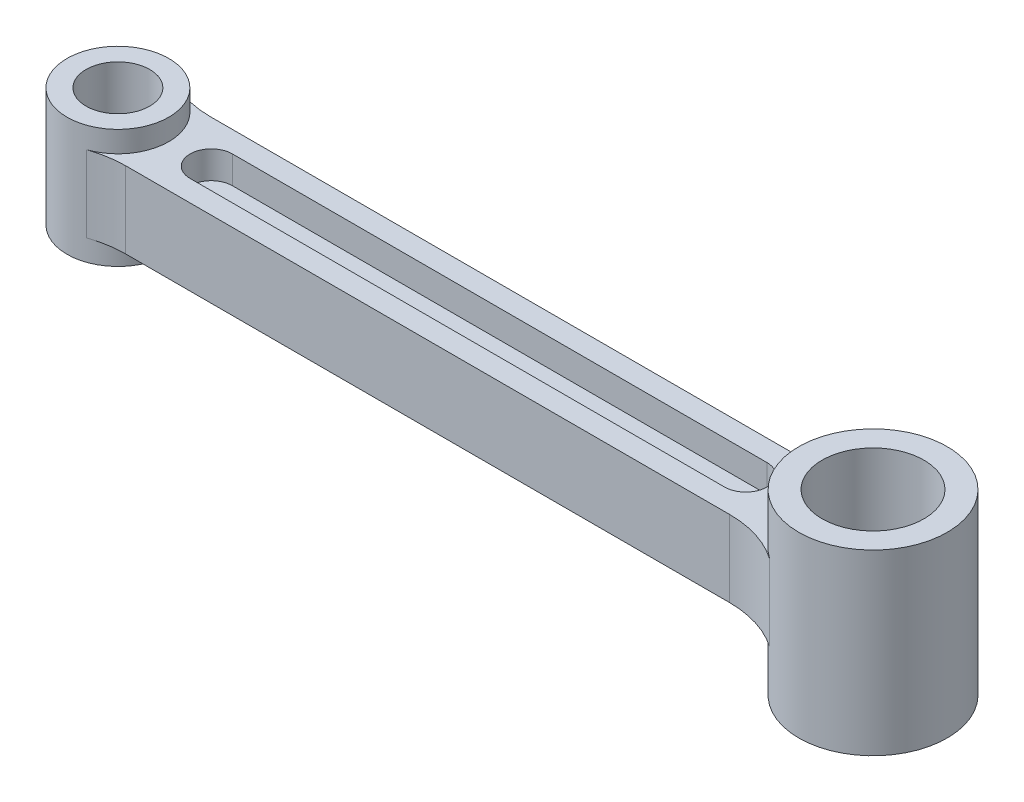
ISO-10303-21;
HEADER;
FILE_DESCRIPTION(('STEP AP214'),'2;1');
FILE_NAME('part.step','',(''),(''),'','','');
FILE_SCHEMA(('AUTOMOTIVE_DESIGN { 1 0 10303 214 1 1 1 1 }'));
ENDSEC;
DATA;
#1=APPLICATION_CONTEXT('core data for automotive mechanical design processes');
#2=APPLICATION_PROTOCOL_DEFINITION('international standard','automotive_design',2000,#1);
#3=PRODUCT_CONTEXT('',#1,'mechanical');
#4=PRODUCT('Part','Part','',(#3));
#5=PRODUCT_RELATED_PRODUCT_CATEGORY('part','',(#4));
#6=PRODUCT_DEFINITION_FORMATION('','',#4);
#7=PRODUCT_DEFINITION_CONTEXT('part definition',#1,'design');
#8=PRODUCT_DEFINITION('design','',#6,#7);
#9=PRODUCT_DEFINITION_SHAPE('','',#8);
#10=(LENGTH_UNIT() NAMED_UNIT(*) SI_UNIT(.MILLI.,.METRE.));
#11=(NAMED_UNIT(*) PLANE_ANGLE_UNIT() SI_UNIT($,.RADIAN.));
#12=(NAMED_UNIT(*) SI_UNIT($,.STERADIAN.) SOLID_ANGLE_UNIT());
#13=UNCERTAINTY_MEASURE_WITH_UNIT(LENGTH_MEASURE(1.E-05),#10,'distance_accuracy_value','');
#14=(GEOMETRIC_REPRESENTATION_CONTEXT(3) GLOBAL_UNCERTAINTY_ASSIGNED_CONTEXT((#13)) GLOBAL_UNIT_ASSIGNED_CONTEXT((#10,
#11,#12)) REPRESENTATION_CONTEXT('',''));
#15=CARTESIAN_POINT('',(0.,0.,0.));
#16=DIRECTION('',(0.,0.,1.));
#17=DIRECTION('',(1.,0.,0.));
#18=AXIS2_PLACEMENT_3D('',#15,#16,#17);
#19=CARTESIAN_POINT('',(-63.,-9.,0.));
#20=DIRECTION('',(0.,1.,0.));
#21=DIRECTION('',(0.,0.,1.));
#22=AXIS2_PLACEMENT_3D('',#19,#20,#21);
#23=CYLINDRICAL_SURFACE('',#22,5.);
#24=CARTESIAN_POINT('',(-63.,-2.5,0.));
#25=DIRECTION('',(0.,1.,0.));
#26=DIRECTION('',(0.,0.,1.));
#27=AXIS2_PLACEMENT_3D('',#24,#25,#26);
#28=CIRCLE('',#27,5.);
#29=CARTESIAN_POINT('',(-63.,-2.5,-5.));
#30=VERTEX_POINT('',#29);
#31=CARTESIAN_POINT('',(-63.,-2.5,5.));
#32=VERTEX_POINT('',#31);
#33=EDGE_CURVE('E193',#30,#32,#28,.T.);
#34=ORIENTED_EDGE('',*,*,#33,.T.);
#35=DIRECTION('',(0.,1.,0.));
#36=VECTOR('',#35,1.);
#37=CARTESIAN_POINT('',(-63.,-9.,5.));
#38=LINE('',#37,#36);
#39=CARTESIAN_POINT('',(-63.,-9.,5.));
#40=VERTEX_POINT('',#39);
#41=EDGE_CURVE('E336',#40,#32,#38,.T.);
#42=ORIENTED_EDGE('',*,*,#41,.F.);
#43=CARTESIAN_POINT('',(-63.,-9.,0.));
#44=DIRECTION('',(0.,1.,0.));
#45=DIRECTION('',(0.,0.,1.));
#46=AXIS2_PLACEMENT_3D('',#43,#44,#45);
#47=CIRCLE('',#46,5.);
#48=CARTESIAN_POINT('',(-63.,-9.,-5.));
#49=VERTEX_POINT('',#48);
#50=EDGE_CURVE('E265',#49,#40,#47,.T.);
#51=ORIENTED_EDGE('',*,*,#50,.F.);
#52=DIRECTION('',(0.,1.,0.));
#53=VECTOR('',#52,1.);
#54=CARTESIAN_POINT('',(-63.,-9.,-5.));
#55=LINE('',#54,#53);
#56=EDGE_CURVE('E172',#49,#30,#55,.T.);
#57=ORIENTED_EDGE('',*,*,#56,.T.);
#58=EDGE_LOOP('',(#34,#42,#51,#57));
#59=FACE_BOUND('',#58,.T.);
#60=ADVANCED_FACE('F47',(#59),#23,.F.);
#61=CARTESIAN_POINT('',(0.,-9.,5.));
#62=DIRECTION('',(0.,0.,1.));
#63=DIRECTION('',(1.,0.,0.));
#64=AXIS2_PLACEMENT_3D('',#61,#62,#63);
#65=PLANE('',#64);
#66=DIRECTION('',(1.,0.,0.));
#67=VECTOR('',#66,1.);
#68=CARTESIAN_POINT('',(0.,-2.5,5.));
#69=LINE('',#68,#67);
#70=CARTESIAN_POINT('',(63.,-2.5,5.));
#71=VERTEX_POINT('',#70);
#72=EDGE_CURVE('E197',#32,#71,#69,.T.);
#73=ORIENTED_EDGE('',*,*,#72,.T.);
#74=DIRECTION('',(0.,1.,0.));
#75=VECTOR('',#74,1.);
#76=CARTESIAN_POINT('',(63.,-9.,5.));
#77=LINE('',#76,#75);
#78=CARTESIAN_POINT('',(63.,-9.,5.));
#79=VERTEX_POINT('',#78);
#80=EDGE_CURVE('E340',#79,#71,#77,.T.);
#81=ORIENTED_EDGE('',*,*,#80,.F.);
#82=DIRECTION('',(1.,0.,0.));
#83=VECTOR('',#82,1.);
#84=CARTESIAN_POINT('',(0.,-9.,5.));
#85=LINE('',#84,#83);
#86=EDGE_CURVE('E276',#40,#79,#85,.T.);
#87=ORIENTED_EDGE('',*,*,#86,.F.);
#88=ORIENTED_EDGE('',*,*,#41,.T.);
#89=EDGE_LOOP('',(#73,#81,#87,#88));
#90=FACE_BOUND('',#89,.T.);
#91=ADVANCED_FACE('F428',(#90),#65,.F.);
#92=CARTESIAN_POINT('',(63.,-9.,0.));
#93=DIRECTION('',(0.,1.,0.));
#94=DIRECTION('',(0.,0.,1.));
#95=AXIS2_PLACEMENT_3D('',#92,#93,#94);
#96=CYLINDRICAL_SURFACE('',#95,5.);
#97=CARTESIAN_POINT('',(63.,-2.5,0.));
#98=DIRECTION('',(0.,1.,0.));
#99=DIRECTION('',(0.,0.,1.));
#100=AXIS2_PLACEMENT_3D('',#97,#98,#99);
#101=CIRCLE('',#100,5.);
#102=CARTESIAN_POINT('',(63.,-2.5,-5.));
#103=VERTEX_POINT('',#102);
#104=EDGE_CURVE('E201',#71,#103,#101,.T.);
#105=ORIENTED_EDGE('',*,*,#104,.T.);
#106=DIRECTION('',(0.,1.,0.));
#107=VECTOR('',#106,1.);
#108=CARTESIAN_POINT('',(63.,-9.,-5.));
#109=LINE('',#108,#107);
#110=CARTESIAN_POINT('',(63.,-9.,-5.));
#111=VERTEX_POINT('',#110);
#112=EDGE_CURVE('E345',#111,#103,#109,.T.);
#113=ORIENTED_EDGE('',*,*,#112,.F.);
#114=CARTESIAN_POINT('',(63.,-9.,0.));
#115=DIRECTION('',(0.,1.,0.));
#116=DIRECTION('',(0.,0.,1.));
#117=AXIS2_PLACEMENT_3D('',#114,#115,#116);
#118=CIRCLE('',#117,5.);
#119=EDGE_CURVE('E273',#79,#111,#118,.T.);
#120=ORIENTED_EDGE('',*,*,#119,.F.);
#121=ORIENTED_EDGE('',*,*,#80,.T.);
#122=EDGE_LOOP('',(#105,#113,#120,#121));
#123=FACE_BOUND('',#122,.T.);
#124=ADVANCED_FACE('F435',(#123),#96,.F.);
#125=CARTESIAN_POINT('',(0.,-9.,-5.));
#126=DIRECTION('',(0.,0.,1.));
#127=DIRECTION('',(1.,0.,0.));
#128=AXIS2_PLACEMENT_3D('',#125,#126,#127);
#129=PLANE('',#128);
#130=ORIENTED_EDGE('',*,*,#112,.T.);
#131=DIRECTION('',(1.,0.,0.));
#132=VECTOR('',#131,1.);
#133=CARTESIAN_POINT('',(0.,-2.5,-5.));
#134=LINE('',#133,#132);
#135=EDGE_CURVE('E190',#30,#103,#134,.T.);
#136=ORIENTED_EDGE('',*,*,#135,.F.);
#137=ORIENTED_EDGE('',*,*,#56,.F.);
#138=DIRECTION('',(1.,0.,0.));
#139=VECTOR('',#138,1.);
#140=CARTESIAN_POINT('',(0.,-9.,-5.));
#141=LINE('',#140,#139);
#142=EDGE_CURVE('E269',#49,#111,#141,.T.);
#143=ORIENTED_EDGE('',*,*,#142,.T.);
#144=EDGE_LOOP('',(#130,#136,#137,#143));
#145=FACE_BOUND('',#144,.T.);
#146=ADVANCED_FACE('F379',(#145),#129,.T.);
#147=CARTESIAN_POINT('',(93.,-21.,0.));
#148=DIRECTION('',(0.,1.,0.));
#149=DIRECTION('',(0.,0.,1.));
#150=AXIS2_PLACEMENT_3D('',#147,#148,#149);
#151=CYLINDRICAL_SURFACE('',#150,17.5);
#152=CARTESIAN_POINT('',(93.,-21.,0.));
#153=DIRECTION('',(0.,1.,0.));
#154=DIRECTION('',(0.,0.,1.));
#155=AXIS2_PLACEMENT_3D('',#152,#153,#154);
#156=CIRCLE('',#155,17.5);
#157=CARTESIAN_POINT('',(93.,-21.,17.5));
#158=VERTEX_POINT('',#157);
#159=EDGE_CURVE('E11',#158,#158,#156,.T.);
#160=ORIENTED_EDGE('',*,*,#159,.T.);
#161=EDGE_LOOP('',(#160));
#162=FACE_BOUND('',#161,.T.);
#163=CARTESIAN_POINT('',(93.,21.,0.));
#164=DIRECTION('',(0.,1.,0.));
#165=DIRECTION('',(0.,0.,1.));
#166=AXIS2_PLACEMENT_3D('',#163,#164,#165);
#167=CIRCLE('',#166,17.5);
#168=CARTESIAN_POINT('',(93.,21.,17.5));
#169=VERTEX_POINT('',#168);
#170=EDGE_CURVE('E355',#169,#169,#167,.T.);
#171=ORIENTED_EDGE('',*,*,#170,.F.);
#172=EDGE_LOOP('',(#171));
#173=FACE_BOUND('',#172,.T.);
#174=DIRECTION('',(0.,1.,0.));
#175=VECTOR('',#174,1.);
#176=CARTESIAN_POINT('',(82.9655387662608,-9.,14.3373493975904));
#177=LINE('',#176,#175);
#178=CARTESIAN_POINT('',(82.9655387662608,-9.,14.3373493975904));
#179=VERTEX_POINT('',#178);
#180=CARTESIAN_POINT('',(82.9655387662608,9.,14.3373493975904));
#181=VERTEX_POINT('',#180);
#182=EDGE_CURVE('E322',#179,#181,#177,.T.);
#183=ORIENTED_EDGE('',*,*,#182,.F.);
#184=CARTESIAN_POINT('',(93.,-9.,0.));
#185=DIRECTION('',(0.,1.,0.));
#186=DIRECTION('',(0.,0.,1.));
#187=AXIS2_PLACEMENT_3D('',#184,#185,#186);
#188=CIRCLE('',#187,17.5);
#189=CARTESIAN_POINT('',(82.9655387662608,-9.,-14.3373493975904));
#190=VERTEX_POINT('',#189);
#191=EDGE_CURVE('E295',#190,#179,#188,.T.);
#192=ORIENTED_EDGE('',*,*,#191,.F.);
#193=DIRECTION('',(0.,1.,0.));
#194=VECTOR('',#193,1.);
#195=CARTESIAN_POINT('',(82.9655387662608,-9.,-14.3373493975904));
#196=LINE('',#195,#194);
#197=CARTESIAN_POINT('',(82.9655387662608,9.,-14.3373493975904));
#198=VERTEX_POINT('',#197);
#199=EDGE_CURVE('E319',#190,#198,#196,.T.);
#200=ORIENTED_EDGE('',*,*,#199,.T.);
#201=CARTESIAN_POINT('',(93.,9.,0.));
#202=DIRECTION('',(0.,1.,0.));
#203=DIRECTION('',(0.,0.,1.));
#204=AXIS2_PLACEMENT_3D('',#201,#202,#203);
#205=CIRCLE('',#204,17.5);
#206=EDGE_CURVE('E250',#198,#181,#205,.T.);
#207=ORIENTED_EDGE('',*,*,#206,.T.);
#208=EDGE_LOOP('',(#183,#192,#200,#207));
#209=FACE_BOUND('',#208,.T.);
#210=ADVANCED_FACE('F367',(#162,#173,#209),#151,.T.);
#211=CARTESIAN_POINT('',(93.,-21.,0.));
#212=DIRECTION('',(0.,1.,0.));
#213=DIRECTION('',(0.,0.,1.));
#214=AXIS2_PLACEMENT_3D('',#211,#212,#213);
#215=CYLINDRICAL_SURFACE('',#214,12.);
#216=CARTESIAN_POINT('',(93.,-21.,0.));
#217=DIRECTION('',(0.,1.,0.));
#218=DIRECTION('',(0.,0.,1.));
#219=AXIS2_PLACEMENT_3D('',#216,#217,#218);
#220=CIRCLE('',#219,12.);
#221=CARTESIAN_POINT('',(93.,-21.,12.));
#222=VERTEX_POINT('',#221);
#223=EDGE_CURVE('E56',#222,#222,#220,.T.);
#224=CARTESIAN_POINT('',(93.,21.,0.));
#225=DIRECTION('',(0.,1.,0.));
#226=DIRECTION('',(0.,0.,1.));
#227=AXIS2_PLACEMENT_3D('',#224,#225,#226);
#228=CIRCLE('',#227,12.);
#229=CARTESIAN_POINT('',(93.,21.,12.));
#230=VERTEX_POINT('',#229);
#231=EDGE_CURVE('E312',#230,#230,#228,.T.);
#232=CARTESIAN_POINT('',(93.,-21.,12.));
#233=CARTESIAN_POINT('',(93.,-20.5625,12.));
#234=CARTESIAN_POINT('',(93.,-20.125,12.));
#235=CARTESIAN_POINT('',(93.,-19.25,12.));
#236=CARTESIAN_POINT('',(93.,-18.8125,12.));
#237=CARTESIAN_POINT('',(93.,-17.9375,12.));
#238=CARTESIAN_POINT('',(93.,-17.5,12.));
#239=CARTESIAN_POINT('',(93.,-16.625,12.));
#240=CARTESIAN_POINT('',(93.,-16.1875,12.));
#241=CARTESIAN_POINT('',(93.,-15.3125,12.));
#242=CARTESIAN_POINT('',(93.,-14.875,12.));
#243=CARTESIAN_POINT('',(93.,-14.,12.));
#244=CARTESIAN_POINT('',(93.,-13.5625,12.));
#245=CARTESIAN_POINT('',(93.,-12.6875,12.));
#246=CARTESIAN_POINT('',(93.,-12.25,12.));
#247=CARTESIAN_POINT('',(93.,-11.375,12.));
#248=CARTESIAN_POINT('',(93.,-10.9375,12.));
#249=CARTESIAN_POINT('',(93.,-10.0625,12.));
#250=CARTESIAN_POINT('',(93.,-9.625,12.));
#251=CARTESIAN_POINT('',(93.,-8.75,12.));
#252=CARTESIAN_POINT('',(93.,-8.3125,12.));
#253=CARTESIAN_POINT('',(93.,-7.4375,12.));
#254=CARTESIAN_POINT('',(93.,-7.,12.));
#255=CARTESIAN_POINT('',(93.,-6.125,12.));
#256=CARTESIAN_POINT('',(93.,-5.6875,12.));
#257=CARTESIAN_POINT('',(93.,-4.8125,12.));
#258=CARTESIAN_POINT('',(93.,-4.375,12.));
#259=CARTESIAN_POINT('',(93.,-3.5,12.));
#260=CARTESIAN_POINT('',(93.,-3.0625,12.));
#261=CARTESIAN_POINT('',(93.,-2.18750000000001,12.));
#262=CARTESIAN_POINT('',(93.,-1.75000000000001,12.));
#263=CARTESIAN_POINT('',(93.,-0.875000000000004,12.));
#264=CARTESIAN_POINT('',(93.,-0.437500000000004,12.));
#265=CARTESIAN_POINT('',(93.,0.437499999999997,12.));
#266=CARTESIAN_POINT('',(93.,0.874999999999997,12.));
#267=CARTESIAN_POINT('',(93.,1.75,12.));
#268=CARTESIAN_POINT('',(93.,2.1875,12.));
#269=CARTESIAN_POINT('',(93.,3.0625,12.));
#270=CARTESIAN_POINT('',(93.,3.5,12.));
#271=CARTESIAN_POINT('',(93.,4.375,12.));
#272=CARTESIAN_POINT('',(93.,4.8125,12.));
#273=CARTESIAN_POINT('',(93.,5.6875,12.));
#274=CARTESIAN_POINT('',(93.,6.125,12.));
#275=CARTESIAN_POINT('',(93.,7.,12.));
#276=CARTESIAN_POINT('',(93.,7.4375,12.));
#277=CARTESIAN_POINT('',(93.,8.3125,12.));
#278=CARTESIAN_POINT('',(93.,8.75,12.));
#279=CARTESIAN_POINT('',(93.,9.625,12.));
#280=CARTESIAN_POINT('',(93.,10.0625,12.));
#281=CARTESIAN_POINT('',(93.,10.9375,12.));
#282=CARTESIAN_POINT('',(93.,11.375,12.));
#283=CARTESIAN_POINT('',(93.,12.25,12.));
#284=CARTESIAN_POINT('',(93.,12.6875,12.));
#285=CARTESIAN_POINT('',(93.,13.5625,12.));
#286=CARTESIAN_POINT('',(93.,14.,12.));
#287=CARTESIAN_POINT('',(93.,14.875,12.));
#288=CARTESIAN_POINT('',(93.,15.3125,12.));
#289=CARTESIAN_POINT('',(93.,16.1875,12.));
#290=CARTESIAN_POINT('',(93.,16.625,12.));
#291=CARTESIAN_POINT('',(93.,17.5,12.));
#292=CARTESIAN_POINT('',(93.,17.9375,12.));
#293=CARTESIAN_POINT('',(93.,18.8125,12.));
#294=CARTESIAN_POINT('',(93.,19.25,12.));
#295=CARTESIAN_POINT('',(93.,20.125,12.));
#296=CARTESIAN_POINT('',(93.,20.5625,12.));
#297=CARTESIAN_POINT('',(93.,21.,12.));
#298=B_SPLINE_CURVE_WITH_KNOTS('',3,(#232,#233,#234,#235,#236,#237,#238,#239,#240,#241,#242,
#243,#244,#245,#246,#247,#248,#249,#250,#251,#252,#253,#254,#255,#256,#257,#258,#259,#260,#261,
#262,#263,#264,#265,#266,#267,#268,#269,#270,#271,#272,#273,#274,#275,#276,#277,#278,#279,#280,
#281,#282,#283,#284,#285,#286,#287,#288,#289,#290,#291,#292,#293,#294,#295,#296,#297),
.UNSPECIFIED.,.F.,.F.,(4,2,2,2,2,2,2,2,2,2,2,2,2,2,2,2,2,2,2,2,2,2,2,2,2,2,2,2,2,2,2,2,4),(0.,
1.3125,2.625,3.9375,5.25,6.5625,7.875,9.1875,10.5,11.8125,13.125,14.4375,15.75,17.0625,18.375,
19.6875,21.,22.3125,23.625,24.9375,26.25,27.5625,28.875,30.1875,31.5,32.8125,34.125,35.4375,
36.75,38.0625,39.375,40.6875,42.),.UNSPECIFIED.);
#299=EDGE_CURVE('BSEAM49',#222,#230,#298,.T.);
#300=ORIENTED_EDGE('',*,*,#223,.F.);
#301=ORIENTED_EDGE('',*,*,#231,.T.);
#302=ORIENTED_EDGE('',*,*,#299,.T.);
#303=ORIENTED_EDGE('',*,*,#299,.F.);
#304=EDGE_LOOP('',(#300,#302,#301,#303));
#305=FACE_BOUND('',#304,.T.);
#306=ADVANCED_FACE('F49',(#305),#215,.F.);
#307=CARTESIAN_POINT('',(0.,-21.,0.));
#308=DIRECTION('',(0.,1.,0.));
#309=DIRECTION('',(0.,0.,1.));
#310=AXIS2_PLACEMENT_3D('',#307,#308,#309);
#311=PLANE('',#310);
#312=ORIENTED_EDGE('',*,*,#223,.T.);
#313=EDGE_LOOP('',(#312));
#314=FACE_BOUND('',#313,.T.);
#315=ORIENTED_EDGE('',*,*,#159,.F.);
#316=EDGE_LOOP('',(#315));
#317=FACE_BOUND('',#316,.T.);
#318=ADVANCED_FACE('F362',(#314,#317),#311,.F.);
#319=CARTESIAN_POINT('',(0.,21.,0.));
#320=DIRECTION('',(0.,1.,0.));
#321=DIRECTION('',(0.,0.,1.));
#322=AXIS2_PLACEMENT_3D('',#319,#320,#321);
#323=PLANE('',#322);
#324=ORIENTED_EDGE('',*,*,#231,.F.);
#325=EDGE_LOOP('',(#324));
#326=FACE_BOUND('',#325,.T.);
#327=ORIENTED_EDGE('',*,*,#170,.T.);
#328=EDGE_LOOP('',(#327));
#329=FACE_BOUND('',#328,.T.);
#330=ADVANCED_FACE('F370',(#326,#329),#323,.T.);
#331=CARTESIAN_POINT('',(-73.1678404338008,-9.,-34.));
#332=DIRECTION('',(0.,1.,0.));
#333=DIRECTION('',(0.,0.,1.));
#334=AXIS2_PLACEMENT_3D('',#331,#332,#333);
#335=CYLINDRICAL_SURFACE('',#334,24.);
#336=DIRECTION('',(0.,1.,0.));
#337=VECTOR('',#336,1.);
#338=CARTESIAN_POINT('',(-81.0559468112669,-9.,-11.3333333333333));
#339=LINE('',#338,#337);
#340=CARTESIAN_POINT('',(-81.0559468112669,-9.,-11.3333333333333));
#341=VERTEX_POINT('',#340);
#342=CARTESIAN_POINT('',(-81.0559468112669,9.,-11.3333333333333));
#343=VERTEX_POINT('',#342);
#344=EDGE_CURVE('E308',#341,#343,#339,.T.);
#345=ORIENTED_EDGE('',*,*,#344,.T.);
#346=CARTESIAN_POINT('',(-73.1678404338008,9.,-34.));
#347=DIRECTION('',(0.,1.,0.));
#348=DIRECTION('',(0.,0.,1.));
#349=AXIS2_PLACEMENT_3D('',#346,#347,#348);
#350=CIRCLE('',#349,24.);
#351=CARTESIAN_POINT('',(-73.1678404338008,9.,-10.));
#352=VERTEX_POINT('',#351);
#353=EDGE_CURVE('E261',#343,#352,#350,.T.);
#354=ORIENTED_EDGE('',*,*,#353,.T.);
#355=DIRECTION('',(0.,1.,0.));
#356=VECTOR('',#355,1.);
#357=CARTESIAN_POINT('',(-73.1678404338008,-9.,-10.));
#358=LINE('',#357,#356);
#359=CARTESIAN_POINT('',(-73.1678404338008,-9.,-10.));
#360=VERTEX_POINT('',#359);
#361=EDGE_CURVE('E313',#360,#352,#358,.T.);
#362=ORIENTED_EDGE('',*,*,#361,.F.);
#363=CARTESIAN_POINT('',(-73.1678404338008,-9.,-34.));
#364=DIRECTION('',(0.,1.,0.));
#365=DIRECTION('',(0.,0.,1.));
#366=AXIS2_PLACEMENT_3D('',#363,#364,#365);
#367=CIRCLE('',#366,24.);
#368=EDGE_CURVE('E173',#341,#360,#367,.T.);
#369=ORIENTED_EDGE('',*,*,#368,.F.);
#370=EDGE_LOOP('',(#345,#354,#362,#369));
#371=FACE_BOUND('',#370,.T.);
#372=ADVANCED_FACE('F373',(#371),#335,.F.);
#373=CARTESIAN_POINT('',(0.,-9.,-10.));
#374=DIRECTION('',(0.,0.,1.));
#375=DIRECTION('',(1.,0.,0.));
#376=AXIS2_PLACEMENT_3D('',#373,#374,#375);
#377=PLANE('',#376);
#378=ORIENTED_EDGE('',*,*,#361,.T.);
#379=DIRECTION('',(1.,0.,0.));
#380=VECTOR('',#379,1.);
#381=CARTESIAN_POINT('',(0.,9.,-10.));
#382=LINE('',#381,#380);
#383=CARTESIAN_POINT('',(69.2039919314184,9.,-10.));
#384=VERTEX_POINT('',#383);
#385=EDGE_CURVE('E257',#352,#384,#382,.T.);
#386=ORIENTED_EDGE('',*,*,#385,.T.);
#387=DIRECTION('',(0.,1.,0.));
#388=VECTOR('',#387,1.);
#389=CARTESIAN_POINT('',(69.2039919314184,-9.,-10.));
#390=LINE('',#389,#388);
#391=CARTESIAN_POINT('',(69.2039919314184,-9.,-10.));
#392=VERTEX_POINT('',#391);
#393=EDGE_CURVE('E316',#392,#384,#390,.T.);
#394=ORIENTED_EDGE('',*,*,#393,.F.);
#395=DIRECTION('',(1.,0.,0.));
#396=VECTOR('',#395,1.);
#397=CARTESIAN_POINT('',(0.,-9.,-10.));
#398=LINE('',#397,#396);
#399=EDGE_CURVE('E303',#360,#392,#398,.T.);
#400=ORIENTED_EDGE('',*,*,#399,.F.);
#401=EDGE_LOOP('',(#378,#386,#394,#400));
#402=FACE_BOUND('',#401,.T.);
#403=ADVANCED_FACE('F408',(#402),#377,.F.);
#404=CARTESIAN_POINT('',(69.2039919314184,-9.,-34.));
#405=DIRECTION('',(0.,1.,0.));
#406=DIRECTION('',(0.,0.,1.));
#407=AXIS2_PLACEMENT_3D('',#404,#405,#406);
#408=CYLINDRICAL_SURFACE('',#407,24.);
#409=ORIENTED_EDGE('',*,*,#393,.T.);
#410=CARTESIAN_POINT('',(69.2039919314184,9.,-34.));
#411=DIRECTION('',(0.,1.,0.));
#412=DIRECTION('',(0.,0.,1.));
#413=AXIS2_PLACEMENT_3D('',#410,#411,#412);
#414=CIRCLE('',#413,24.);
#415=EDGE_CURVE('E253',#384,#198,#414,.T.);
#416=ORIENTED_EDGE('',*,*,#415,.T.);
#417=ORIENTED_EDGE('',*,*,#199,.F.);
#418=CARTESIAN_POINT('',(69.2039919314184,-9.,-34.));
#419=DIRECTION('',(0.,1.,0.));
#420=DIRECTION('',(0.,0.,1.));
#421=AXIS2_PLACEMENT_3D('',#418,#419,#420);
#422=CIRCLE('',#421,24.);
#423=EDGE_CURVE('E299',#392,#190,#422,.T.);
#424=ORIENTED_EDGE('',*,*,#423,.F.);
#425=EDGE_LOOP('',(#409,#416,#417,#424));
#426=FACE_BOUND('',#425,.T.);
#427=ADVANCED_FACE('F411',(#426),#408,.F.);
#428=CARTESIAN_POINT('',(69.2039919314184,-9.,34.));
#429=DIRECTION('',(0.,1.,0.));
#430=DIRECTION('',(0.,0.,1.));
#431=AXIS2_PLACEMENT_3D('',#428,#429,#430);
#432=CYLINDRICAL_SURFACE('',#431,24.);
#433=ORIENTED_EDGE('',*,*,#182,.T.);
#434=CARTESIAN_POINT('',(69.2039919314184,9.,34.));
#435=DIRECTION('',(0.,1.,0.));
#436=DIRECTION('',(0.,0.,1.));
#437=AXIS2_PLACEMENT_3D('',#434,#435,#436);
#438=CIRCLE('',#437,24.);
#439=CARTESIAN_POINT('',(69.2039919314184,9.,10.));
#440=VERTEX_POINT('',#439);
#441=EDGE_CURVE('E246',#440,#181,#438,.F.);
#442=ORIENTED_EDGE('',*,*,#441,.F.);
#443=DIRECTION('',(0.,1.,0.));
#444=VECTOR('',#443,1.);
#445=CARTESIAN_POINT('',(69.2039919314184,-9.,10.));
#446=LINE('',#445,#444);
#447=CARTESIAN_POINT('',(69.2039919314184,-9.,10.));
#448=VERTEX_POINT('',#447);
#449=EDGE_CURVE('E326',#448,#440,#446,.T.);
#450=ORIENTED_EDGE('',*,*,#449,.F.);
#451=CARTESIAN_POINT('',(69.2039919314184,-9.,34.));
#452=DIRECTION('',(0.,1.,0.));
#453=DIRECTION('',(0.,0.,1.));
#454=AXIS2_PLACEMENT_3D('',#451,#452,#453);
#455=CIRCLE('',#454,24.);
#456=EDGE_CURVE('E291',#448,#179,#455,.F.);
#457=ORIENTED_EDGE('',*,*,#456,.T.);
#458=EDGE_LOOP('',(#433,#442,#450,#457));
#459=FACE_BOUND('',#458,.T.);
#460=ADVANCED_FACE('F390',(#459),#432,.F.);
#461=CARTESIAN_POINT('',(0.,-9.,10.));
#462=DIRECTION('',(0.,0.,1.));
#463=DIRECTION('',(1.,0.,0.));
#464=AXIS2_PLACEMENT_3D('',#461,#462,#463);
#465=PLANE('',#464);
#466=ORIENTED_EDGE('',*,*,#449,.T.);
#467=DIRECTION('',(1.,0.,0.));
#468=VECTOR('',#467,1.);
#469=CARTESIAN_POINT('',(0.,9.,10.));
#470=LINE('',#469,#468);
#471=CARTESIAN_POINT('',(-73.1678404338008,9.,10.));
#472=VERTEX_POINT('',#471);
#473=EDGE_CURVE('E242',#472,#440,#470,.T.);
#474=ORIENTED_EDGE('',*,*,#473,.F.);
#475=DIRECTION('',(0.,1.,0.));
#476=VECTOR('',#475,1.);
#477=CARTESIAN_POINT('',(-73.1678404338008,-9.,10.));
#478=LINE('',#477,#476);
#479=CARTESIAN_POINT('',(-73.1678404338008,-9.,10.));
#480=VERTEX_POINT('',#479);
#481=EDGE_CURVE('E329',#480,#472,#478,.T.);
#482=ORIENTED_EDGE('',*,*,#481,.F.);
#483=DIRECTION('',(1.,0.,0.));
#484=VECTOR('',#483,1.);
#485=CARTESIAN_POINT('',(0.,-9.,10.));
#486=LINE('',#485,#484);
#487=EDGE_CURVE('E287',#480,#448,#486,.T.);
#488=ORIENTED_EDGE('',*,*,#487,.T.);
#489=EDGE_LOOP('',(#466,#474,#482,#488));
#490=FACE_BOUND('',#489,.T.);
#491=ADVANCED_FACE('F393',(#490),#465,.T.);
#492=CARTESIAN_POINT('',(-63.,2.5,5.));
#493=VERTEX_POINT('',#492);
#494=CARTESIAN_POINT('',(-63.,9.,5.));
#495=VERTEX_POINT('',#494);
#496=EDGE_CURVE('E178',#493,#495,#38,.T.);
#497=ORIENTED_EDGE('',*,*,#496,.F.);
#498=CARTESIAN_POINT('',(-63.,2.5,0.));
#499=DIRECTION('',(0.,1.,0.));
#500=DIRECTION('',(0.,0.,1.));
#501=AXIS2_PLACEMENT_3D('',#498,#499,#500);
#502=CIRCLE('',#501,5.);
#503=CARTESIAN_POINT('',(-63.,2.5,-5.));
#504=VERTEX_POINT('',#503);
#505=EDGE_CURVE('E176',#504,#493,#502,.T.);
#506=ORIENTED_EDGE('',*,*,#505,.F.);
#507=CARTESIAN_POINT('',(-63.,9.,-5.));
#508=VERTEX_POINT('',#507);
#509=EDGE_CURVE('E161',#504,#508,#55,.T.);
#510=ORIENTED_EDGE('',*,*,#509,.T.);
#511=CARTESIAN_POINT('',(-63.,9.,0.));
#512=DIRECTION('',(0.,1.,0.));
#513=DIRECTION('',(0.,0.,1.));
#514=AXIS2_PLACEMENT_3D('',#511,#512,#513);
#515=CIRCLE('',#514,5.);
#516=EDGE_CURVE('E221',#508,#495,#515,.T.);
#517=ORIENTED_EDGE('',*,*,#516,.T.);
#518=EDGE_LOOP('',(#497,#506,#510,#517));
#519=FACE_BOUND('',#518,.T.);
#520=ADVANCED_FACE('F177',(#519),#23,.F.);
#521=CARTESIAN_POINT('',(63.,2.5,5.));
#522=VERTEX_POINT('',#521);
#523=CARTESIAN_POINT('',(63.,9.,5.));
#524=VERTEX_POINT('',#523);
#525=EDGE_CURVE('E344',#522,#524,#77,.T.);
#526=ORIENTED_EDGE('',*,*,#525,.F.);
#527=DIRECTION('',(1.,0.,0.));
#528=VECTOR('',#527,1.);
#529=CARTESIAN_POINT('',(0.,2.5,5.));
#530=LINE('',#529,#528);
#531=EDGE_CURVE('E63',#493,#522,#530,.T.);
#532=ORIENTED_EDGE('',*,*,#531,.F.);
#533=ORIENTED_EDGE('',*,*,#496,.T.);
#534=DIRECTION('',(1.,0.,0.));
#535=VECTOR('',#534,1.);
#536=CARTESIAN_POINT('',(0.,9.,5.));
#537=LINE('',#536,#535);
#538=EDGE_CURVE('E230',#495,#524,#537,.T.);
#539=ORIENTED_EDGE('',*,*,#538,.T.);
#540=EDGE_LOOP('',(#526,#532,#533,#539));
#541=FACE_BOUND('',#540,.T.);
#542=ADVANCED_FACE('F438',(#541),#65,.F.);
#543=CARTESIAN_POINT('',(63.,2.5,-5.));
#544=VERTEX_POINT('',#543);
#545=CARTESIAN_POINT('',(63.,9.,-5.));
#546=VERTEX_POINT('',#545);
#547=EDGE_CURVE('E348',#544,#546,#109,.T.);
#548=ORIENTED_EDGE('',*,*,#547,.F.);
#549=CARTESIAN_POINT('',(63.,2.5,0.));
#550=DIRECTION('',(0.,1.,0.));
#551=DIRECTION('',(0.,0.,1.));
#552=AXIS2_PLACEMENT_3D('',#549,#550,#551);
#553=CIRCLE('',#552,5.);
#554=EDGE_CURVE('E71',#522,#544,#553,.T.);
#555=ORIENTED_EDGE('',*,*,#554,.F.);
#556=ORIENTED_EDGE('',*,*,#525,.T.);
#557=CARTESIAN_POINT('',(63.,9.,0.));
#558=DIRECTION('',(0.,1.,0.));
#559=DIRECTION('',(0.,0.,1.));
#560=AXIS2_PLACEMENT_3D('',#557,#558,#559);
#561=CIRCLE('',#560,5.);
#562=EDGE_CURVE('E226',#524,#546,#561,.T.);
#563=ORIENTED_EDGE('',*,*,#562,.T.);
#564=EDGE_LOOP('',(#548,#555,#556,#563));
#565=FACE_BOUND('',#564,.T.);
#566=ADVANCED_FACE('F445',(#565),#96,.F.);
#567=DIRECTION('',(1.,0.,0.));
#568=VECTOR('',#567,1.);
#569=CARTESIAN_POINT('',(0.,2.5,-5.));
#570=LINE('',#569,#568);
#571=EDGE_CURVE('E165',#504,#544,#570,.T.);
#572=ORIENTED_EDGE('',*,*,#571,.T.);
#573=ORIENTED_EDGE('',*,*,#547,.T.);
#574=DIRECTION('',(1.,0.,0.));
#575=VECTOR('',#574,1.);
#576=CARTESIAN_POINT('',(0.,9.,-5.));
#577=LINE('',#576,#575);
#578=EDGE_CURVE('E167',#508,#546,#577,.T.);
#579=ORIENTED_EDGE('',*,*,#578,.F.);
#580=ORIENTED_EDGE('',*,*,#509,.F.);
#581=EDGE_LOOP('',(#572,#573,#579,#580));
#582=FACE_BOUND('',#581,.T.);
#583=ADVANCED_FACE('F163',(#582),#129,.T.);
#584=CARTESIAN_POINT('',(-73.1678404338008,-9.,34.));
#585=DIRECTION('',(0.,1.,0.));
#586=DIRECTION('',(0.,0.,1.));
#587=AXIS2_PLACEMENT_3D('',#584,#585,#586);
#588=CYLINDRICAL_SURFACE('',#587,24.);
#589=ORIENTED_EDGE('',*,*,#481,.T.);
#590=CARTESIAN_POINT('',(-73.1678404338008,9.,34.));
#591=DIRECTION('',(0.,1.,0.));
#592=DIRECTION('',(0.,0.,1.));
#593=AXIS2_PLACEMENT_3D('',#590,#591,#592);
#594=CIRCLE('',#593,24.);
#595=CARTESIAN_POINT('',(-81.0559468112669,9.,11.3333333333333));
#596=VERTEX_POINT('',#595);
#597=EDGE_CURVE('E238',#596,#472,#594,.F.);
#598=ORIENTED_EDGE('',*,*,#597,.F.);
#599=DIRECTION('',(0.,1.,0.));
#600=VECTOR('',#599,1.);
#601=CARTESIAN_POINT('',(-81.0559468112669,-9.,11.3333333333333));
#602=LINE('',#601,#600);
#603=CARTESIAN_POINT('',(-81.0559468112669,-9.,11.3333333333333));
#604=VERTEX_POINT('',#603);
#605=EDGE_CURVE('E332',#604,#596,#602,.T.);
#606=ORIENTED_EDGE('',*,*,#605,.F.);
#607=CARTESIAN_POINT('',(-73.1678404338008,-9.,34.));
#608=DIRECTION('',(0.,1.,0.));
#609=DIRECTION('',(0.,0.,1.));
#610=AXIS2_PLACEMENT_3D('',#607,#608,#609);
#611=CIRCLE('',#610,24.);
#612=EDGE_CURVE('E283',#604,#480,#611,.F.);
#613=ORIENTED_EDGE('',*,*,#612,.T.);
#614=EDGE_LOOP('',(#589,#598,#606,#613));
#615=FACE_BOUND('',#614,.T.);
#616=ADVANCED_FACE('F397',(#615),#588,.F.);
#617=CARTESIAN_POINT('',(0.,-9.,0.));
#618=DIRECTION('',(0.,1.,0.));
#619=DIRECTION('',(0.,0.,1.));
#620=AXIS2_PLACEMENT_3D('',#617,#618,#619);
#621=PLANE('',#620);
#622=ORIENTED_EDGE('',*,*,#50,.T.);
#623=ORIENTED_EDGE('',*,*,#86,.T.);
#624=ORIENTED_EDGE('',*,*,#119,.T.);
#625=ORIENTED_EDGE('',*,*,#142,.F.);
#626=EDGE_LOOP('',(#622,#623,#624,#625));
#627=FACE_BOUND('',#626,.T.);
#628=CARTESIAN_POINT('',(-85.,-9.,0.));
#629=DIRECTION('',(0.,1.,0.));
#630=DIRECTION('',(0.,0.,1.));
#631=AXIS2_PLACEMENT_3D('',#628,#629,#630);
#632=CIRCLE('',#631,12.);
#633=EDGE_CURVE('E279',#604,#341,#632,.T.);
#634=ORIENTED_EDGE('',*,*,#633,.T.);
#635=ORIENTED_EDGE('',*,*,#368,.T.);
#636=ORIENTED_EDGE('',*,*,#399,.T.);
#637=ORIENTED_EDGE('',*,*,#423,.T.);
#638=ORIENTED_EDGE('',*,*,#191,.T.);
#639=ORIENTED_EDGE('',*,*,#456,.F.);
#640=ORIENTED_EDGE('',*,*,#487,.F.);
#641=ORIENTED_EDGE('',*,*,#612,.F.);
#642=EDGE_LOOP('',(#634,#635,#636,#637,#638,#639,#640,#641));
#643=FACE_BOUND('',#642,.T.);
#644=ADVANCED_FACE('F386',(#627,#643),#621,.F.);
#645=CARTESIAN_POINT('',(0.,9.,0.));
#646=DIRECTION('',(0.,1.,0.));
#647=DIRECTION('',(0.,0.,1.));
#648=AXIS2_PLACEMENT_3D('',#645,#646,#647);
#649=PLANE('',#648);
#650=ORIENTED_EDGE('',*,*,#516,.F.);
#651=ORIENTED_EDGE('',*,*,#578,.T.);
#652=ORIENTED_EDGE('',*,*,#562,.F.);
#653=ORIENTED_EDGE('',*,*,#538,.F.);
#654=EDGE_LOOP('',(#650,#651,#652,#653));
#655=FACE_BOUND('',#654,.T.);
#656=CARTESIAN_POINT('',(-85.,9.,0.));
#657=DIRECTION('',(0.,1.,0.));
#658=DIRECTION('',(0.,0.,1.));
#659=AXIS2_PLACEMENT_3D('',#656,#657,#658);
#660=CIRCLE('',#659,12.);
#661=EDGE_CURVE('E234',#596,#343,#660,.T.);
#662=ORIENTED_EDGE('',*,*,#661,.F.);
#663=ORIENTED_EDGE('',*,*,#597,.T.);
#664=ORIENTED_EDGE('',*,*,#473,.T.);
#665=ORIENTED_EDGE('',*,*,#441,.T.);
#666=ORIENTED_EDGE('',*,*,#206,.F.);
#667=ORIENTED_EDGE('',*,*,#415,.F.);
#668=ORIENTED_EDGE('',*,*,#385,.F.);
#669=ORIENTED_EDGE('',*,*,#353,.F.);
#670=EDGE_LOOP('',(#662,#663,#664,#665,#666,#667,#668,#669));
#671=FACE_BOUND('',#670,.T.);
#672=ADVANCED_FACE('F413',(#655,#671),#649,.T.);
#673=CARTESIAN_POINT('',(-85.,-14.,0.));
#674=DIRECTION('',(0.,1.,0.));
#675=DIRECTION('',(0.,0.,1.));
#676=AXIS2_PLACEMENT_3D('',#673,#674,#675);
#677=CYLINDRICAL_SURFACE('',#676,12.);
#678=CARTESIAN_POINT('',(-85.,14.,0.));
#679=DIRECTION('',(0.,1.,0.));
#680=DIRECTION('',(0.,0.,1.));
#681=AXIS2_PLACEMENT_3D('',#678,#679,#680);
#682=CIRCLE('',#681,12.);
#683=CARTESIAN_POINT('',(-85.,14.,12.));
#684=VERTEX_POINT('',#683);
#685=EDGE_CURVE('E209',#684,#684,#682,.T.);
#686=ORIENTED_EDGE('',*,*,#685,.F.);
#687=EDGE_LOOP('',(#686));
#688=FACE_BOUND('',#687,.T.);
#689=CARTESIAN_POINT('',(-85.,-14.,0.));
#690=DIRECTION('',(0.,1.,0.));
#691=DIRECTION('',(0.,0.,1.));
#692=AXIS2_PLACEMENT_3D('',#689,#690,#691);
#693=CIRCLE('',#692,12.);
#694=CARTESIAN_POINT('',(-85.,-14.,12.));
#695=VERTEX_POINT('',#694);
#696=EDGE_CURVE('E217',#695,#695,#693,.T.);
#697=ORIENTED_EDGE('',*,*,#696,.T.);
#698=EDGE_LOOP('',(#697));
#699=FACE_BOUND('',#698,.T.);
#700=ORIENTED_EDGE('',*,*,#633,.F.);
#701=ORIENTED_EDGE('',*,*,#605,.T.);
#702=ORIENTED_EDGE('',*,*,#661,.T.);
#703=ORIENTED_EDGE('',*,*,#344,.F.);
#704=EDGE_LOOP('',(#700,#701,#702,#703));
#705=FACE_BOUND('',#704,.T.);
#706=ADVANCED_FACE('F400',(#688,#699,#705),#677,.T.);
#707=CARTESIAN_POINT('',(-85.,-14.,0.));
#708=DIRECTION('',(0.,1.,0.));
#709=DIRECTION('',(0.,0.,1.));
#710=AXIS2_PLACEMENT_3D('',#707,#708,#709);
#711=CYLINDRICAL_SURFACE('',#710,7.50000000000001);
#712=CARTESIAN_POINT('',(-85.,-14.,0.));
#713=DIRECTION('',(0.,1.,0.));
#714=DIRECTION('',(0.,0.,1.));
#715=AXIS2_PLACEMENT_3D('',#712,#713,#714);
#716=CIRCLE('',#715,7.50000000000001);
#717=CARTESIAN_POINT('',(-85.,-14.,7.50000000000001));
#718=VERTEX_POINT('',#717);
#719=EDGE_CURVE('E213',#718,#718,#716,.T.);
#720=ORIENTED_EDGE('',*,*,#719,.F.);
#721=EDGE_LOOP('',(#720));
#722=FACE_BOUND('',#721,.T.);
#723=CARTESIAN_POINT('',(-85.,14.,0.));
#724=DIRECTION('',(0.,1.,0.));
#725=DIRECTION('',(0.,0.,1.));
#726=AXIS2_PLACEMENT_3D('',#723,#724,#725);
#727=CIRCLE('',#726,7.50000000000001);
#728=CARTESIAN_POINT('',(-85.,14.,7.50000000000001));
#729=VERTEX_POINT('',#728);
#730=EDGE_CURVE('E205',#729,#729,#727,.T.);
#731=ORIENTED_EDGE('',*,*,#730,.T.);
#732=EDGE_LOOP('',(#731));
#733=FACE_BOUND('',#732,.T.);
#734=ADVANCED_FACE('F421',(#722,#733),#711,.F.);
#735=CARTESIAN_POINT('',(0.,-14.,0.));
#736=DIRECTION('',(0.,1.,0.));
#737=DIRECTION('',(0.,0.,1.));
#738=AXIS2_PLACEMENT_3D('',#735,#736,#737);
#739=PLANE('',#738);
#740=ORIENTED_EDGE('',*,*,#719,.T.);
#741=EDGE_LOOP('',(#740));
#742=FACE_BOUND('',#741,.T.);
#743=ORIENTED_EDGE('',*,*,#696,.F.);
#744=EDGE_LOOP('',(#743));
#745=FACE_BOUND('',#744,.T.);
#746=ADVANCED_FACE('F484',(#742,#745),#739,.F.);
#747=CARTESIAN_POINT('',(0.,14.,0.));
#748=DIRECTION('',(0.,1.,0.));
#749=DIRECTION('',(0.,0.,1.));
#750=AXIS2_PLACEMENT_3D('',#747,#748,#749);
#751=PLANE('',#750);
#752=ORIENTED_EDGE('',*,*,#730,.F.);
#753=EDGE_LOOP('',(#752));
#754=FACE_BOUND('',#753,.T.);
#755=ORIENTED_EDGE('',*,*,#685,.T.);
#756=EDGE_LOOP('',(#755));
#757=FACE_BOUND('',#756,.T.);
#758=ADVANCED_FACE('F480',(#754,#757),#751,.T.);
#759=CARTESIAN_POINT('',(0.,2.5,0.));
#760=DIRECTION('',(0.,1.,0.));
#761=DIRECTION('',(0.,0.,1.));
#762=AXIS2_PLACEMENT_3D('',#759,#760,#761);
#763=PLANE('',#762);
#764=ORIENTED_EDGE('',*,*,#571,.F.);
#765=ORIENTED_EDGE('',*,*,#505,.T.);
#766=ORIENTED_EDGE('',*,*,#531,.T.);
#767=ORIENTED_EDGE('',*,*,#554,.T.);
#768=EDGE_LOOP('',(#764,#765,#766,#767));
#769=FACE_BOUND('',#768,.T.);
#770=ADVANCED_FACE('F182',(#769),#763,.T.);
#771=CARTESIAN_POINT('',(0.,-2.5,0.));
#772=DIRECTION('',(0.,1.,0.));
#773=DIRECTION('',(0.,0.,1.));
#774=AXIS2_PLACEMENT_3D('',#771,#772,#773);
#775=PLANE('',#774);
#776=ORIENTED_EDGE('',*,*,#135,.T.);
#777=ORIENTED_EDGE('',*,*,#104,.F.);
#778=ORIENTED_EDGE('',*,*,#72,.F.);
#779=ORIENTED_EDGE('',*,*,#33,.F.);
#780=EDGE_LOOP('',(#776,#777,#778,#779));
#781=FACE_BOUND('',#780,.T.);
#782=ADVANCED_FACE('F473',(#781),#775,.F.);
#783=CLOSED_SHELL('',(#60,#91,#124,#146,#210,#306,#318,#330,#372,#403,#427,#460,#491,#520,#542,
#566,#583,#616,#644,#672,#706,#734,#746,#758,#770,#782));
#784=MANIFOLD_SOLID_BREP('B2',#783);
#785=ADVANCED_BREP_SHAPE_REPRESENTATION('',(#18,#784),#14);
#786=SHAPE_DEFINITION_REPRESENTATION(#9,#785);
ENDSEC;
END-ISO-10303-21;
